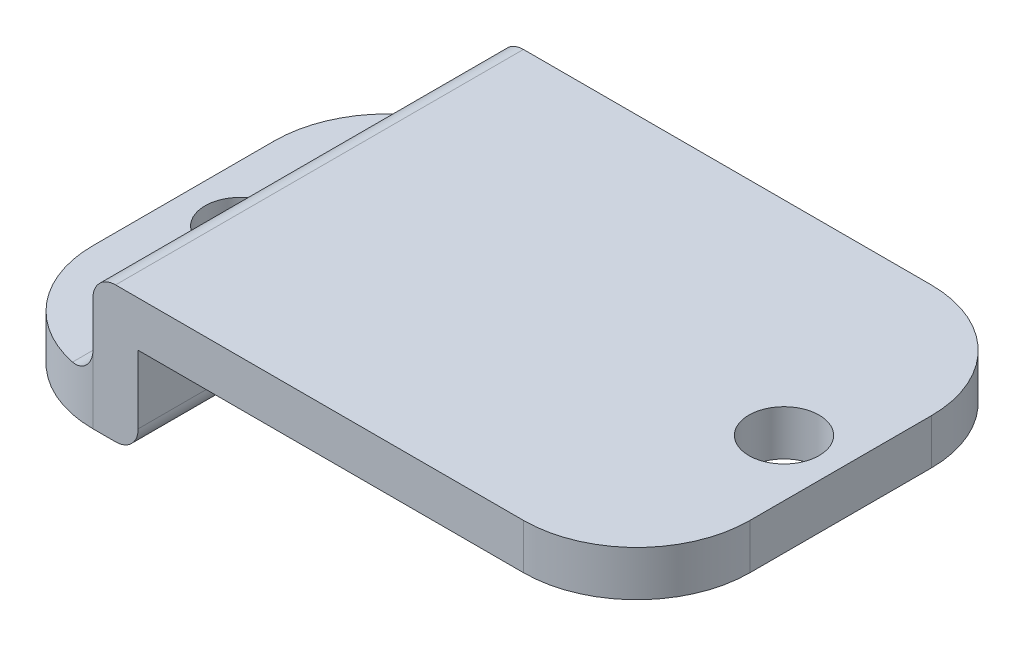
ISO-10303-21;
HEADER;
FILE_DESCRIPTION(('STEP AP214'),'2;1');
FILE_NAME('part.step','',(''),(''),'','','');
FILE_SCHEMA(('AUTOMOTIVE_DESIGN { 1 0 10303 214 1 1 1 1 }'));
ENDSEC;
DATA;
#1=APPLICATION_CONTEXT('core data for automotive mechanical design processes');
#2=APPLICATION_PROTOCOL_DEFINITION('international standard','automotive_design',2000,#1);
#3=PRODUCT_CONTEXT('',#1,'mechanical');
#4=PRODUCT('Part','Part','',(#3));
#5=PRODUCT_RELATED_PRODUCT_CATEGORY('part','',(#4));
#6=PRODUCT_DEFINITION_FORMATION('','',#4);
#7=PRODUCT_DEFINITION_CONTEXT('part definition',#1,'design');
#8=PRODUCT_DEFINITION('design','',#6,#7);
#9=PRODUCT_DEFINITION_SHAPE('','',#8);
#10=(LENGTH_UNIT() NAMED_UNIT(*) SI_UNIT(.MILLI.,.METRE.));
#11=(NAMED_UNIT(*) PLANE_ANGLE_UNIT() SI_UNIT($,.RADIAN.));
#12=(NAMED_UNIT(*) SI_UNIT($,.STERADIAN.) SOLID_ANGLE_UNIT());
#13=UNCERTAINTY_MEASURE_WITH_UNIT(LENGTH_MEASURE(1.E-05),#10,'distance_accuracy_value','');
#14=(GEOMETRIC_REPRESENTATION_CONTEXT(3) GLOBAL_UNCERTAINTY_ASSIGNED_CONTEXT((#13)) GLOBAL_UNIT_ASSIGNED_CONTEXT((#10,
#11,#12)) REPRESENTATION_CONTEXT('',''));
#15=CARTESIAN_POINT('',(0.,0.,0.));
#16=DIRECTION('',(0.,0.,1.));
#17=DIRECTION('',(1.,0.,0.));
#18=AXIS2_PLACEMENT_3D('',#15,#16,#17);
#19=CARTESIAN_POINT('',(0.,0.,18.));
#20=DIRECTION('',(0.,1.,0.));
#21=DIRECTION('',(0.,0.,1.));
#22=AXIS2_PLACEMENT_3D('',#19,#20,#21);
#23=PLANE('',#22);
#24=CARTESIAN_POINT('',(21.5,0.,9.));
#25=DIRECTION('',(0.,1.,0.));
#26=DIRECTION('',(0.,0.,1.));
#27=AXIS2_PLACEMENT_3D('',#24,#25,#26);
#28=CIRCLE('',#27,1.55);
#29=CARTESIAN_POINT('',(21.5,0.,10.55));
#30=VERTEX_POINT('',#29);
#31=EDGE_CURVE('E402',#30,#30,#28,.T.);
#32=ORIENTED_EDGE('',*,*,#31,.T.);
#33=EDGE_LOOP('',(#32));
#34=FACE_BOUND('',#33,.T.);
#35=DIRECTION('',(0.,0.,-1.));
#36=VECTOR('',#35,1.);
#37=CARTESIAN_POINT('',(24.,0.,18.));
#38=LINE('',#37,#36);
#39=CARTESIAN_POINT('',(24.,0.,13.));
#40=VERTEX_POINT('',#39);
#41=CARTESIAN_POINT('',(24.,0.,5.));
#42=VERTEX_POINT('',#41);
#43=EDGE_CURVE('E205',#40,#42,#38,.T.);
#44=ORIENTED_EDGE('',*,*,#43,.F.);
#45=CARTESIAN_POINT('',(19.,0.,13.));
#46=DIRECTION('',(0.,1.,0.));
#47=DIRECTION('',(0.,0.,1.));
#48=AXIS2_PLACEMENT_3D('',#45,#46,#47);
#49=CIRCLE('',#48,5.);
#50=CARTESIAN_POINT('',(19.,0.,18.));
#51=VERTEX_POINT('',#50);
#52=EDGE_CURVE('E172',#40,#51,#49,.F.);
#53=ORIENTED_EDGE('',*,*,#52,.T.);
#54=DIRECTION('',(1.,0.,0.));
#55=VECTOR('',#54,1.);
#56=CARTESIAN_POINT('',(0.,0.,18.));
#57=LINE('',#56,#55);
#58=CARTESIAN_POINT('',(2.,0.,18.));
#59=VERTEX_POINT('',#58);
#60=EDGE_CURVE('E169',#59,#51,#57,.T.);
#61=ORIENTED_EDGE('',*,*,#60,.F.);
#62=DIRECTION('',(0.,0.,-1.));
#63=VECTOR('',#62,1.);
#64=CARTESIAN_POINT('',(2.,0.,18.));
#65=LINE('',#64,#63);
#66=CARTESIAN_POINT('',(2.,0.,0.));
#67=VERTEX_POINT('',#66);
#68=EDGE_CURVE('E155',#59,#67,#65,.T.);
#69=ORIENTED_EDGE('',*,*,#68,.T.);
#70=DIRECTION('',(1.,0.,0.));
#71=VECTOR('',#70,1.);
#72=CARTESIAN_POINT('',(0.,0.,0.));
#73=LINE('',#72,#71);
#74=CARTESIAN_POINT('',(19.,0.,0.));
#75=VERTEX_POINT('',#74);
#76=EDGE_CURVE('E186',#67,#75,#73,.T.);
#77=ORIENTED_EDGE('',*,*,#76,.T.);
#78=CARTESIAN_POINT('',(19.,0.,5.));
#79=DIRECTION('',(0.,1.,0.));
#80=DIRECTION('',(0.,0.,1.));
#81=AXIS2_PLACEMENT_3D('',#78,#79,#80);
#82=CIRCLE('',#81,5.);
#83=EDGE_CURVE('E225',#75,#42,#82,.F.);
#84=ORIENTED_EDGE('',*,*,#83,.T.);
#85=EDGE_LOOP('',(#44,#53,#61,#69,#77,#84));
#86=FACE_BOUND('',#85,.T.);
#87=ADVANCED_FACE('F42',(#34,#86),#23,.F.);
#88=CARTESIAN_POINT('',(24.,0.,18.));
#89=DIRECTION('',(-1.,0.,0.));
#90=DIRECTION('',(0.,0.,1.));
#91=AXIS2_PLACEMENT_3D('',#88,#89,#90);
#92=PLANE('',#91);
#93=DIRECTION('',(0.,0.,-1.));
#94=VECTOR('',#93,1.);
#95=CARTESIAN_POINT('',(24.,2.,18.));
#96=LINE('',#95,#94);
#97=CARTESIAN_POINT('',(24.,2.,13.));
#98=VERTEX_POINT('',#97);
#99=CARTESIAN_POINT('',(24.,2.,5.));
#100=VERTEX_POINT('',#99);
#101=EDGE_CURVE('E202',#98,#100,#96,.T.);
#102=ORIENTED_EDGE('',*,*,#101,.F.);
#103=DIRECTION('',(0.,1.,0.));
#104=VECTOR('',#103,1.);
#105=CARTESIAN_POINT('',(24.,0.,13.));
#106=LINE('',#105,#104);
#107=EDGE_CURVE('E223',#98,#40,#106,.F.);
#108=ORIENTED_EDGE('',*,*,#107,.T.);
#109=ORIENTED_EDGE('',*,*,#43,.T.);
#110=DIRECTION('',(0.,1.,0.));
#111=VECTOR('',#110,1.);
#112=CARTESIAN_POINT('',(24.,0.,5.));
#113=LINE('',#112,#111);
#114=EDGE_CURVE('E220',#42,#100,#113,.T.);
#115=ORIENTED_EDGE('',*,*,#114,.T.);
#116=EDGE_LOOP('',(#102,#108,#109,#115));
#117=FACE_BOUND('',#116,.T.);
#118=ADVANCED_FACE('F340',(#117),#92,.F.);
#119=CARTESIAN_POINT('',(0.,2.,18.));
#120=DIRECTION('',(0.,1.,0.));
#121=DIRECTION('',(0.,0.,1.));
#122=AXIS2_PLACEMENT_3D('',#119,#120,#121);
#123=PLANE('',#122);
#124=CARTESIAN_POINT('',(21.5,2.,9.));
#125=DIRECTION('',(0.,1.,0.));
#126=DIRECTION('',(0.,0.,1.));
#127=AXIS2_PLACEMENT_3D('',#124,#125,#126);
#128=CIRCLE('',#127,1.55);
#129=CARTESIAN_POINT('',(21.5,2.,10.55));
#130=VERTEX_POINT('',#129);
#131=EDGE_CURVE('E416',#130,#130,#128,.T.);
#132=ORIENTED_EDGE('',*,*,#131,.F.);
#133=EDGE_LOOP('',(#132));
#134=FACE_BOUND('',#133,.T.);
#135=DIRECTION('',(1.,0.,0.));
#136=VECTOR('',#135,1.);
#137=CARTESIAN_POINT('',(0.,2.,0.));
#138=LINE('',#137,#136);
#139=CARTESIAN_POINT('',(1.,2.,0.));
#140=VERTEX_POINT('',#139);
#141=CARTESIAN_POINT('',(19.,2.,0.));
#142=VERTEX_POINT('',#141);
#143=EDGE_CURVE('E188',#140,#142,#138,.T.);
#144=ORIENTED_EDGE('',*,*,#143,.F.);
#145=DIRECTION('',(0.,0.,-1.));
#146=VECTOR('',#145,1.);
#147=CARTESIAN_POINT('',(1.,2.,18.));
#148=LINE('',#147,#146);
#149=CARTESIAN_POINT('',(1.,2.,18.));
#150=VERTEX_POINT('',#149);
#151=EDGE_CURVE('E372',#140,#150,#148,.F.);
#152=ORIENTED_EDGE('',*,*,#151,.T.);
#153=DIRECTION('',(1.,0.,0.));
#154=VECTOR('',#153,1.);
#155=CARTESIAN_POINT('',(0.,2.,18.));
#156=LINE('',#155,#154);
#157=CARTESIAN_POINT('',(19.,2.,18.));
#158=VERTEX_POINT('',#157);
#159=EDGE_CURVE('E176',#150,#158,#156,.T.);
#160=ORIENTED_EDGE('',*,*,#159,.T.);
#161=CARTESIAN_POINT('',(19.,2.,13.));
#162=DIRECTION('',(0.,1.,0.));
#163=DIRECTION('',(0.,0.,1.));
#164=AXIS2_PLACEMENT_3D('',#161,#162,#163);
#165=CIRCLE('',#164,5.);
#166=EDGE_CURVE('E218',#158,#98,#165,.T.);
#167=ORIENTED_EDGE('',*,*,#166,.T.);
#168=ORIENTED_EDGE('',*,*,#101,.T.);
#169=CARTESIAN_POINT('',(19.,2.,5.));
#170=DIRECTION('',(0.,1.,0.));
#171=DIRECTION('',(0.,0.,1.));
#172=AXIS2_PLACEMENT_3D('',#169,#170,#171);
#173=CIRCLE('',#172,5.);
#174=EDGE_CURVE('E215',#100,#142,#173,.T.);
#175=ORIENTED_EDGE('',*,*,#174,.T.);
#176=EDGE_LOOP('',(#144,#152,#160,#167,#168,#175));
#177=FACE_BOUND('',#176,.T.);
#178=ADVANCED_FACE('F274',(#134,#177),#123,.T.);
#179=CARTESIAN_POINT('',(0.,0.,18.));
#180=DIRECTION('',(-1.,0.,0.));
#181=DIRECTION('',(0.,0.,1.));
#182=AXIS2_PLACEMENT_3D('',#179,#180,#181);
#183=PLANE('',#182);
#184=DIRECTION('',(0.,1.,0.));
#185=VECTOR('',#184,1.);
#186=CARTESIAN_POINT('',(0.,0.,18.));
#187=LINE('',#186,#185);
#188=CARTESIAN_POINT('',(0.,-1.,18.));
#189=VERTEX_POINT('',#188);
#190=CARTESIAN_POINT('',(0.,1.,18.));
#191=VERTEX_POINT('',#190);
#192=EDGE_CURVE('E182',#189,#191,#187,.T.);
#193=ORIENTED_EDGE('',*,*,#192,.T.);
#194=DIRECTION('',(0.,0.,-1.));
#195=VECTOR('',#194,1.);
#196=CARTESIAN_POINT('',(0.,1.,18.));
#197=LINE('',#196,#195);
#198=CARTESIAN_POINT('',(0.,1.,0.));
#199=VERTEX_POINT('',#198);
#200=EDGE_CURVE('E302',#191,#199,#197,.T.);
#201=ORIENTED_EDGE('',*,*,#200,.T.);
#202=DIRECTION('',(0.,1.,0.));
#203=VECTOR('',#202,1.);
#204=CARTESIAN_POINT('',(0.,0.,0.));
#205=LINE('',#204,#203);
#206=CARTESIAN_POINT('',(0.,-1.,0.));
#207=VERTEX_POINT('',#206);
#208=EDGE_CURVE('E191',#207,#199,#205,.T.);
#209=ORIENTED_EDGE('',*,*,#208,.F.);
#210=DIRECTION('',(0.,0.,-1.));
#211=VECTOR('',#210,1.);
#212=CARTESIAN_POINT('',(0.,-1.,18.));
#213=LINE('',#212,#211);
#214=CARTESIAN_POINT('',(0.,-1.,8.60948751620466));
#215=VERTEX_POINT('',#214);
#216=EDGE_CURVE('E262',#207,#215,#213,.F.);
#217=ORIENTED_EDGE('',*,*,#216,.T.);
#218=CARTESIAN_POINT('',(0.,-1.09003543689552,7.73114573292491));
#219=CARTESIAN_POINT('',(0.,-2.42157033807594,8.12303743279418));
#220=CARTESIAN_POINT('',(-1.31660479774297,-2.,7.99896264041992));
#221=CARTESIAN_POINT('',(0.,-1.07928016102303,7.76768773547615));
#222=CARTESIAN_POINT('',(0.,-2.39908223397735,8.12252411531241));
#223=CARTESIAN_POINT('',(-1.30239846010283,-2.,8.01576355059714));
#224=CARTESIAN_POINT('',(0.,-1.06980181869871,7.80457949808054));
#225=CARTESIAN_POINT('',(0.,-2.37597461450016,8.12553747485484));
#226=CARTESIAN_POINT('',(-1.28788341301531,-2.,8.03364170415246));
#227=CARTESIAN_POINT('',(0.,-1.05311393642863,7.87882876282085));
#228=CARTESIAN_POINT('',(0.,-2.33005241252144,8.13825303283099));
#229=CARTESIAN_POINT('',(-1.25850400990097,-2.,8.07168541794181));
#230=CARTESIAN_POINT('',(0.,-1.04590164320957,7.91618564198294));
#231=CARTESIAN_POINT('',(0.,-2.30723047041813,8.14781522600585));
#232=CARTESIAN_POINT('',(-1.24364010153966,-2.,8.0918481615091));
#233=CARTESIAN_POINT('',(0.,-1.02728421249813,8.02825153154218));
#234=CARTESIAN_POINT('',(0.,-2.24143140090433,8.18513901062904));
#235=CARTESIAN_POINT('',(-1.19906677475243,-2.,8.15574908695555));
#236=CARTESIAN_POINT('',(0.,-1.01876671693618,8.1034352298377));
#237=CARTESIAN_POINT('',(0.,-2.19936494201809,8.22161890935074));
#238=CARTESIAN_POINT('',(-1.16918477752232,-2.,8.20311432810635));
#239=CARTESIAN_POINT('',(0.,-1.00704595596801,8.25389318594509));
#240=CARTESIAN_POINT('',(0.,-2.12450783455355,8.31314430348107));
#241=CARTESIAN_POINT('',(-1.1117459333888,-2.,8.30803971441191));
#242=CARTESIAN_POINT('',(0.,-1.00382562685524,8.32916636822336));
#243=CARTESIAN_POINT('',(0.,-2.09124146326484,8.36771321795233));
#244=CARTESIAN_POINT('',(-1.08418189303075,-2.,8.36556646061761));
#245=CARTESIAN_POINT('',(0.,-1.00025821169638,8.47989462850047));
#246=CARTESIAN_POINT('',(0.,-2.03546129037314,8.48984515653921));
#247=CARTESIAN_POINT('',(-1.03454933046074,-2.,8.49062842180128));
#248=CARTESIAN_POINT('',(0.,-0.999916346581259,8.55534978881912));
#249=CARTESIAN_POINT('',(0.,-2.01249678050055,8.55751719129305));
#250=CARTESIAN_POINT('',(-1.01249086446779,-2.,8.55818159697194));
#251=CARTESIAN_POINT('',(0.,-1.00007371476951,8.6773295298595));
#252=CARTESIAN_POINT('',(0.,-1.98427393708783,8.67335715514308));
#253=CARTESIAN_POINT('',(-0.984083818187835,-2.,8.67356166491347));
#254=CARTESIAN_POINT('',(0.,-1.00030077567148,8.7238571226712));
#255=CARTESIAN_POINT('',(0.,-1.9755489936108,8.71898148410816));
#256=CARTESIAN_POINT('',(-0.974954456115593,-2.,8.71902448191335));
#257=CARTESIAN_POINT('',(0.,-1.00075753191996,8.81691183846399));
#258=CARTESIAN_POINT('',(0.,-1.96222742646399,8.81193038487518));
#259=CARTESIAN_POINT('',(-0.960739932607024,-2.,8.81190076829794));
#260=CARTESIAN_POINT('',(0.,-1.00098722720377,8.86343896142998));
#261=CARTESIAN_POINT('',(0.,-1.95757606354754,8.85942734701155));
#262=CARTESIAN_POINT('',(-0.955654675092457,-2.,8.85931419131277));
#263=CARTESIAN_POINT('',(0.,-1.00125124891286,8.9564565802129));
#264=CARTESIAN_POINT('',(0.,-1.95236079562052,8.95492396736893));
#265=CARTESIAN_POINT('',(-0.949916747067699,-2.,8.95491234886565));
#266=CARTESIAN_POINT('',(0.,-1.0012857313538,9.00294707557984));
#267=CARTESIAN_POINT('',(0.,-1.95177146450425,9.00312318022655));
#268=CARTESIAN_POINT('',(-0.949260536747216,-2.,9.00309643658521));
#269=CARTESIAN_POINT('',(0.,-1.00113494817345,9.09592914931454));
#270=CARTESIAN_POINT('',(0.,-1.95463319292473,9.09891379895112));
#271=CARTESIAN_POINT('',(-0.952421824644977,-2.,9.09902021393609));
#272=CARTESIAN_POINT('',(0.,-1.00094967529898,9.14242072766741));
#273=CARTESIAN_POINT('',(0.,-1.95809660185332,9.14670886801174));
#274=CARTESIAN_POINT('',(-0.956239470525928,-2.,9.14675988884684));
#275=CARTESIAN_POINT('',(0.,-1.00050575805981,9.23552633215981));
#276=CARTESIAN_POINT('',(0.,-1.96905950292135,9.240693757596));
#277=CARTESIAN_POINT('',(-0.968072412476987,-2.,9.2407225358382));
#278=CARTESIAN_POINT('',(0.,-1.00024692116838,9.28214035733437));
#279=CARTESIAN_POINT('',(0.,-1.97661536063471,9.28706202308078));
#280=CARTESIAN_POINT('',(-0.976098770503647,-2.,9.28694116823137));
#281=CARTESIAN_POINT('',(0.,-0.999960345997754,9.37536524054435));
#282=CARTESIAN_POINT('',(0.,-1.99574510861641,9.3769583589127));
#283=CARTESIAN_POINT('',(-0.995775993751439,-2.,9.37672859624485));
#284=CARTESIAN_POINT('',(0.,-0.99993258804094,9.42197609851144));
#285=CARTESIAN_POINT('',(0.,-2.00739396028633,9.42062756422832));
#286=CARTESIAN_POINT('',(-1.00742655026489,-2.,9.42029761718019));
#287=CARTESIAN_POINT('',(0.,-1.00052945831433,9.51524057756412));
#288=CARTESIAN_POINT('',(0.,-2.03467061674831,9.50405933041651));
#289=CARTESIAN_POINT('',(-1.03360596920178,-2.,9.50410026805277));
#290=CARTESIAN_POINT('',(0.,-1.00115468748894,9.56189419849248));
#291=CARTESIAN_POINT('',(0.,-2.0504000742091,9.54389963788757));
#292=CARTESIAN_POINT('',(-1.04813747298292,-2.,9.54433078875475));
#293=CARTESIAN_POINT('',(0.,-1.00357615075752,9.65518504907134));
#294=CARTESIAN_POINT('',(0.,-2.0856338616496,9.61860045491195));
#295=CARTESIAN_POINT('',(-1.07925861405162,-2.,9.62106475279473));
#296=CARTESIAN_POINT('',(0.,-1.00537279056877,9.70182226743931));
#297=CARTESIAN_POINT('',(0.,-2.10524987075338,9.65347354744946));
#298=CARTESIAN_POINT('',(-1.09584896280623,-2.,9.65756689974471));
#299=CARTESIAN_POINT('',(0.,-1.00801403384658,9.7484269904827));
#300=CARTESIAN_POINT('',(0.,-2.12644609345599,9.68482687535042));
#301=CARTESIAN_POINT('',(-1.11305657091066,-2.,9.6920172862768));
#302=(BOUNDED_SURFACE() B_SPLINE_SURFACE(3,2,((#218,#219,#220),(#221,#222,#223),(#224,#225,
#226),(#227,#228,#229),(#230,#231,#232),(#233,#234,#235),(#236,#237,#238),(#239,#240,#241),
(#242,#243,#244),(#245,#246,#247),(#248,#249,#250),(#251,#252,#253),(#254,#255,#256),(#257,#258,
#259),(#260,#261,#262),(#263,#264,#265),(#266,#267,#268),(#269,#270,#271),(#272,#273,#274),
(#275,#276,#277),(#278,#279,#280),(#281,#282,#283),(#284,#285,#286),(#287,#288,#289),(#290,#291,
#292),(#293,#294,#295),(#296,#297,#298),(#299,#300,#301)),.UNSPECIFIED.,.F.,.F.,
.F.) B_SPLINE_SURFACE_WITH_KNOTS((4,2,2,2,2,2,2,2,2,2,2,2,2,4),(3,3),(0.,0.114215310613203,
0.228291306929113,0.454960161183239,0.680897409239857,0.90724437207455,1.04683026861018,
1.1864128488201,1.32588385775956,1.46535947016544,1.60520352413813,1.74503566951408,
1.8849966159806,2.02500606359473),(0.,1.),
.UNSPECIFIED.) GEOMETRIC_REPRESENTATION_ITEM() RATIONAL_B_SPLINE_SURFACE(((1.,0.584549057931422,
1.),(1.,0.590626395726221,1.),(1.,0.596737597822393,1.),(1.,0.608920968233159,1.),(1.,
0.61499317506706,1.),(1.,0.632935967591139,1.),(1.,0.644614205713254,1.),(1.,0.666518620231557,
1.),(1.,0.676749361704814,1.),(1.,0.694844157032491,1.),(1.,0.702703885490777,1.),(1.,
0.712722125647196,1.),(1.,0.715911167890255,1.),(1.,0.720857989376532,1.),(1.,0.722615802622349,
1.),(1.,0.724598271992875,1.),(1.,0.724824152478987,1.),(1.,0.723732936008131,1.),(1.,
0.722415788122447,1.),(1.,0.718309069889206,1.),(1.,0.715515619152292,1.),(1.,0.708607000482008,
1.),(1.,0.704491945121388,1.),(1.,0.695139249167702,1.),(1.,0.689900578039128,1.),(1.,
0.678530608941541,1.),(1.,0.672399002276571,1.),(1.,0.665936719624822,1.))) REPRESENTATION_ITEM('') SURFACE());
#303=CARTESIAN_POINT('',(0.,-1.09003543689552,7.73114573292491));
#304=CARTESIAN_POINT('',(0.,-1.07928016102303,7.76768773547615));
#305=CARTESIAN_POINT('',(0.,-1.06980181869871,7.80457949808054));
#306=CARTESIAN_POINT('',(0.,-1.05311393642863,7.87882876282085));
#307=CARTESIAN_POINT('',(0.,-1.04590164320957,7.91618564198294));
#308=CARTESIAN_POINT('',(0.,-1.02728421249813,8.02825153154218));
#309=CARTESIAN_POINT('',(0.,-1.01876671693618,8.1034352298377));
#310=CARTESIAN_POINT('',(0.,-1.00704595596801,8.25389318594509));
#311=CARTESIAN_POINT('',(0.,-1.00382562685524,8.32916636822336));
#312=CARTESIAN_POINT('',(0.,-1.00025821169638,8.47989462850047));
#313=CARTESIAN_POINT('',(0.,-0.999916346581259,8.55534978881912));
#314=CARTESIAN_POINT('',(0.,-1.00007371476951,8.6773295298595));
#315=CARTESIAN_POINT('',(0.,-1.00030077567148,8.7238571226712));
#316=CARTESIAN_POINT('',(0.,-1.00075753191996,8.81691183846399));
#317=CARTESIAN_POINT('',(0.,-1.00098722720377,8.86343896142998));
#318=CARTESIAN_POINT('',(0.,-1.00125124891286,8.9564565802129));
#319=CARTESIAN_POINT('',(0.,-1.0012857313538,9.00294707557984));
#320=CARTESIAN_POINT('',(0.,-1.00113494817345,9.09592914931455));
#321=CARTESIAN_POINT('',(0.,-1.00094967529898,9.14242072766741));
#322=CARTESIAN_POINT('',(0.,-1.00050575805981,9.23552633215981));
#323=CARTESIAN_POINT('',(0.,-1.00024692116838,9.28214035733437));
#324=CARTESIAN_POINT('',(0.,-0.999960345997754,9.37536524054435));
#325=CARTESIAN_POINT('',(0.,-0.99993258804094,9.42197609851144));
#326=CARTESIAN_POINT('',(0.,-1.00052945831433,9.51524057756412));
#327=CARTESIAN_POINT('',(0.,-1.00115468748894,9.56189419849248));
#328=CARTESIAN_POINT('',(0.,-1.00357615075752,9.65518504907134));
#329=CARTESIAN_POINT('',(0.,-1.00537279056877,9.70182226743931));
#330=CARTESIAN_POINT('',(0.,-1.00801403384658,9.7484269904827));
#331=B_SPLINE_CURVE_WITH_KNOTS('',3,(#303,#304,#305,#306,#307,#308,#309,#310,#311,#312,#313,
#314,#315,#316,#317,#318,#319,#320,#321,#322,#323,#324,#325,#326,#327,#328,#329,#330),
.UNSPECIFIED.,.F.,.F.,(4,2,2,2,2,2,2,2,2,2,2,2,2,4),(0.,0.114215310613203,0.228291306929113,
0.454960161183239,0.680897409239857,0.90724437207455,1.04683026861018,1.1864128488201,
1.32588385775956,1.46535947016544,1.60520352413813,1.74503566951408,1.8849966159806,
2.02500606359473),.UNSPECIFIED.);
#332=CARTESIAN_POINT('',(0.,-1.,9.39051248379533));
#333=VERTEX_POINT('',#332);
#334=EDGE_CURVE('E254',#215,#333,#331,.T.);
#335=ORIENTED_EDGE('',*,*,#334,.T.);
#336=DIRECTION('',(0.,0.,-1.));
#337=VECTOR('',#336,1.);
#338=CARTESIAN_POINT('',(0.,-1.,18.));
#339=LINE('',#338,#337);
#340=EDGE_CURVE('E251',#333,#189,#339,.F.);
#341=ORIENTED_EDGE('',*,*,#340,.T.);
#342=EDGE_LOOP('',(#193,#201,#209,#217,#335,#341));
#343=FACE_BOUND('',#342,.T.);
#344=ADVANCED_FACE('F268',(#343),#183,.T.);
#345=CARTESIAN_POINT('',(0.,-2.,18.));
#346=DIRECTION('',(0.,-1.,0.));
#347=DIRECTION('',(0.,0.,-1.));
#348=AXIS2_PLACEMENT_3D('',#345,#346,#347);
#349=PLANE('',#348);
#350=CARTESIAN_POINT('',(0.,-2.,13.));
#351=DIRECTION('',(0.,-1.,0.));
#352=DIRECTION('',(0.,0.,-1.));
#353=AXIS2_PLACEMENT_3D('',#350,#351,#352);
#354=CIRCLE('',#353,5.);
#355=CARTESIAN_POINT('',(-5.,-2.,13.));
#356=VERTEX_POINT('',#355);
#357=CARTESIAN_POINT('',(-1.,-2.,17.8989794855664));
#358=VERTEX_POINT('',#357);
#359=EDGE_CURVE('E232',#356,#358,#354,.F.);
#360=ORIENTED_EDGE('',*,*,#359,.T.);
#361=DIRECTION('',(0.,0.,-1.));
#362=VECTOR('',#361,1.);
#363=CARTESIAN_POINT('',(-1.,-2.,18.));
#364=LINE('',#363,#362);
#365=CARTESIAN_POINT('',(-1.,-2.,9.39051248379533));
#366=VERTEX_POINT('',#365);
#367=EDGE_CURVE('E248',#358,#366,#364,.T.);
#368=ORIENTED_EDGE('',*,*,#367,.T.);
#369=CARTESIAN_POINT('',(-2.5,-2.,9.));
#370=DIRECTION('',(0.,1.,0.));
#371=DIRECTION('',(0.,0.,1.));
#372=AXIS2_PLACEMENT_3D('',#369,#370,#371);
#373=CIRCLE('',#372,1.55);
#374=CARTESIAN_POINT('',(-1.,-2.,8.60948751620466));
#375=VERTEX_POINT('',#374);
#376=EDGE_CURVE('E400',#375,#366,#373,.T.);
#377=ORIENTED_EDGE('',*,*,#376,.F.);
#378=DIRECTION('',(0.,0.,-1.));
#379=VECTOR('',#378,1.);
#380=CARTESIAN_POINT('',(-1.,-2.,18.));
#381=LINE('',#380,#379);
#382=CARTESIAN_POINT('',(-1.,-2.,0.101020514433644));
#383=VERTEX_POINT('',#382);
#384=EDGE_CURVE('E246',#375,#383,#381,.T.);
#385=ORIENTED_EDGE('',*,*,#384,.T.);
#386=CARTESIAN_POINT('',(0.,-2.,5.));
#387=DIRECTION('',(0.,-1.,0.));
#388=DIRECTION('',(0.,0.,-1.));
#389=AXIS2_PLACEMENT_3D('',#386,#387,#388);
#390=CIRCLE('',#389,5.);
#391=CARTESIAN_POINT('',(-5.,-2.,5.));
#392=VERTEX_POINT('',#391);
#393=EDGE_CURVE('E235',#383,#392,#390,.F.);
#394=ORIENTED_EDGE('',*,*,#393,.T.);
#395=DIRECTION('',(0.,0.,-1.));
#396=VECTOR('',#395,1.);
#397=CARTESIAN_POINT('',(-5.,-2.,18.));
#398=LINE('',#397,#396);
#399=EDGE_CURVE('E199',#356,#392,#398,.T.);
#400=ORIENTED_EDGE('',*,*,#399,.F.);
#401=EDGE_LOOP('',(#360,#368,#377,#385,#394,#400));
#402=FACE_BOUND('',#401,.T.);
#403=ADVANCED_FACE('F273',(#402),#349,.F.);
#404=CARTESIAN_POINT('',(-5.,0.,18.));
#405=DIRECTION('',(-1.,0.,0.));
#406=DIRECTION('',(0.,0.,1.));
#407=AXIS2_PLACEMENT_3D('',#404,#405,#406);
#408=PLANE('',#407);
#409=ORIENTED_EDGE('',*,*,#399,.T.);
#410=DIRECTION('',(0.,1.,0.));
#411=VECTOR('',#410,1.);
#412=CARTESIAN_POINT('',(-5.,-4.,5.));
#413=LINE('',#412,#411);
#414=CARTESIAN_POINT('',(-5.,-4.,5.));
#415=VERTEX_POINT('',#414);
#416=EDGE_CURVE('E240',#392,#415,#413,.F.);
#417=ORIENTED_EDGE('',*,*,#416,.T.);
#418=DIRECTION('',(0.,0.,-1.));
#419=VECTOR('',#418,1.);
#420=CARTESIAN_POINT('',(-5.,-4.,18.));
#421=LINE('',#420,#419);
#422=CARTESIAN_POINT('',(-5.,-4.,13.));
#423=VERTEX_POINT('',#422);
#424=EDGE_CURVE('E166',#423,#415,#421,.T.);
#425=ORIENTED_EDGE('',*,*,#424,.F.);
#426=DIRECTION('',(0.,1.,0.));
#427=VECTOR('',#426,1.);
#428=CARTESIAN_POINT('',(-5.,0.,13.));
#429=LINE('',#428,#427);
#430=EDGE_CURVE('E237',#423,#356,#429,.T.);
#431=ORIENTED_EDGE('',*,*,#430,.T.);
#432=EDGE_LOOP('',(#409,#417,#425,#431));
#433=FACE_BOUND('',#432,.T.);
#434=ADVANCED_FACE('F408',(#433),#408,.T.);
#435=CARTESIAN_POINT('',(0.,-4.,18.));
#436=DIRECTION('',(0.,1.,0.));
#437=DIRECTION('',(0.,0.,1.));
#438=AXIS2_PLACEMENT_3D('',#435,#436,#437);
#439=PLANE('',#438);
#440=CARTESIAN_POINT('',(-2.5,-4.,9.));
#441=DIRECTION('',(0.,1.,0.));
#442=DIRECTION('',(0.,0.,1.));
#443=AXIS2_PLACEMENT_3D('',#440,#441,#442);
#444=CIRCLE('',#443,1.55);
#445=CARTESIAN_POINT('',(-2.5,-4.,10.55));
#446=VERTEX_POINT('',#445);
#447=EDGE_CURVE('E189',#446,#446,#444,.T.);
#448=ORIENTED_EDGE('',*,*,#447,.T.);
#449=EDGE_LOOP('',(#448));
#450=FACE_BOUND('',#449,.T.);
#451=DIRECTION('',(1.,0.,0.));
#452=VECTOR('',#451,1.);
#453=CARTESIAN_POINT('',(0.,-4.,0.));
#454=LINE('',#453,#452);
#455=CARTESIAN_POINT('',(0.,-4.,0.));
#456=VERTEX_POINT('',#455);
#457=CARTESIAN_POINT('',(1.,-4.,0.));
#458=VERTEX_POINT('',#457);
#459=EDGE_CURVE('E194',#456,#458,#454,.T.);
#460=ORIENTED_EDGE('',*,*,#459,.T.);
#461=DIRECTION('',(0.,0.,-1.));
#462=VECTOR('',#461,1.);
#463=CARTESIAN_POINT('',(1.,-4.,18.));
#464=LINE('',#463,#462);
#465=CARTESIAN_POINT('',(1.,-4.,18.));
#466=VERTEX_POINT('',#465);
#467=EDGE_CURVE('E50',#458,#466,#464,.F.);
#468=ORIENTED_EDGE('',*,*,#467,.T.);
#469=DIRECTION('',(1.,0.,0.));
#470=VECTOR('',#469,1.);
#471=CARTESIAN_POINT('',(0.,-4.,18.));
#472=LINE('',#471,#470);
#473=CARTESIAN_POINT('',(0.,-4.,18.));
#474=VERTEX_POINT('',#473);
#475=EDGE_CURVE('E180',#474,#466,#472,.T.);
#476=ORIENTED_EDGE('',*,*,#475,.F.);
#477=CARTESIAN_POINT('',(0.,-4.,13.));
#478=DIRECTION('',(0.,1.,0.));
#479=DIRECTION('',(0.,0.,1.));
#480=AXIS2_PLACEMENT_3D('',#477,#478,#479);
#481=CIRCLE('',#480,5.);
#482=EDGE_CURVE('E242',#474,#423,#481,.F.);
#483=ORIENTED_EDGE('',*,*,#482,.T.);
#484=ORIENTED_EDGE('',*,*,#424,.T.);
#485=CARTESIAN_POINT('',(0.,-4.,5.));
#486=DIRECTION('',(0.,1.,0.));
#487=DIRECTION('',(0.,0.,1.));
#488=AXIS2_PLACEMENT_3D('',#485,#486,#487);
#489=CIRCLE('',#488,5.);
#490=EDGE_CURVE('E244',#415,#456,#489,.F.);
#491=ORIENTED_EDGE('',*,*,#490,.T.);
#492=EDGE_LOOP('',(#460,#468,#476,#483,#484,#491));
#493=FACE_BOUND('',#492,.T.);
#494=ADVANCED_FACE('F405',(#450,#493),#439,.F.);
#495=CARTESIAN_POINT('',(2.,0.,18.));
#496=DIRECTION('',(1.,0.,0.));
#497=DIRECTION('',(0.,1.,0.));
#498=AXIS2_PLACEMENT_3D('',#495,#496,#497);
#499=PLANE('',#498);
#500=DIRECTION('',(0.,-1.,0.));
#501=VECTOR('',#500,1.);
#502=CARTESIAN_POINT('',(2.,0.,18.));
#503=LINE('',#502,#501);
#504=CARTESIAN_POINT('',(2.,-3.,18.));
#505=VERTEX_POINT('',#504);
#506=EDGE_CURVE('E160',#59,#505,#503,.T.);
#507=ORIENTED_EDGE('',*,*,#506,.T.);
#508=DIRECTION('',(0.,0.,-1.));
#509=VECTOR('',#508,1.);
#510=CARTESIAN_POINT('',(2.,-3.,0.));
#511=LINE('',#510,#509);
#512=CARTESIAN_POINT('',(2.,-3.,0.));
#513=VERTEX_POINT('',#512);
#514=EDGE_CURVE('E374',#505,#513,#511,.T.);
#515=ORIENTED_EDGE('',*,*,#514,.T.);
#516=DIRECTION('',(0.,-1.,0.));
#517=VECTOR('',#516,1.);
#518=CARTESIAN_POINT('',(2.,0.,0.));
#519=LINE('',#518,#517);
#520=EDGE_CURVE('E162',#67,#513,#519,.T.);
#521=ORIENTED_EDGE('',*,*,#520,.F.);
#522=ORIENTED_EDGE('',*,*,#68,.F.);
#523=EDGE_LOOP('',(#507,#515,#521,#522));
#524=FACE_BOUND('',#523,.T.);
#525=ADVANCED_FACE('F157',(#524),#499,.T.);
#526=CARTESIAN_POINT('',(0.,0.,18.));
#527=DIRECTION('',(0.,0.,1.));
#528=DIRECTION('',(1.,0.,0.));
#529=AXIS2_PLACEMENT_3D('',#526,#527,#528);
#530=PLANE('',#529);
#531=ORIENTED_EDGE('',*,*,#475,.T.);
#532=CARTESIAN_POINT('',(1.,-3.,18.));
#533=DIRECTION('',(0.,0.,1.));
#534=DIRECTION('',(1.,0.,0.));
#535=AXIS2_PLACEMENT_3D('',#532,#533,#534);
#536=CIRCLE('',#535,1.);
#537=EDGE_CURVE('E11',#466,#505,#536,.T.);
#538=ORIENTED_EDGE('',*,*,#537,.T.);
#539=ORIENTED_EDGE('',*,*,#506,.F.);
#540=ORIENTED_EDGE('',*,*,#60,.T.);
#541=DIRECTION('',(0.,1.,0.));
#542=VECTOR('',#541,1.);
#543=CARTESIAN_POINT('',(19.,2.,18.));
#544=LINE('',#543,#542);
#545=EDGE_CURVE('E213',#51,#158,#544,.T.);
#546=ORIENTED_EDGE('',*,*,#545,.T.);
#547=ORIENTED_EDGE('',*,*,#159,.F.);
#548=CARTESIAN_POINT('',(1.,1.,18.));
#549=DIRECTION('',(0.,0.,1.));
#550=DIRECTION('',(1.,0.,0.));
#551=AXIS2_PLACEMENT_3D('',#548,#549,#550);
#552=CIRCLE('',#551,1.);
#553=EDGE_CURVE('E365',#150,#191,#552,.T.);
#554=ORIENTED_EDGE('',*,*,#553,.T.);
#555=ORIENTED_EDGE('',*,*,#192,.F.);
#556=DIRECTION('',(0.,1.,0.));
#557=VECTOR('',#556,1.);
#558=CARTESIAN_POINT('',(0.,0.,18.));
#559=LINE('',#558,#557);
#560=EDGE_CURVE('E208',#189,#474,#559,.F.);
#561=ORIENTED_EDGE('',*,*,#560,.T.);
#562=EDGE_LOOP('',(#531,#538,#539,#540,#546,#547,#554,#555,#561));
#563=FACE_BOUND('',#562,.T.);
#564=ADVANCED_FACE('F178',(#563),#530,.T.);
#565=CARTESIAN_POINT('',(0.,0.,0.));
#566=DIRECTION('',(0.,0.,1.));
#567=DIRECTION('',(1.,0.,0.));
#568=AXIS2_PLACEMENT_3D('',#565,#566,#567);
#569=PLANE('',#568);
#570=ORIENTED_EDGE('',*,*,#520,.T.);
#571=CARTESIAN_POINT('',(1.,-3.,0.));
#572=DIRECTION('',(0.,0.,1.));
#573=DIRECTION('',(1.,0.,0.));
#574=AXIS2_PLACEMENT_3D('',#571,#572,#573);
#575=CIRCLE('',#574,1.);
#576=EDGE_CURVE('E64',#513,#458,#575,.F.);
#577=ORIENTED_EDGE('',*,*,#576,.T.);
#578=ORIENTED_EDGE('',*,*,#459,.F.);
#579=DIRECTION('',(0.,1.,0.));
#580=VECTOR('',#579,1.);
#581=CARTESIAN_POINT('',(0.,-2.,0.));
#582=LINE('',#581,#580);
#583=EDGE_CURVE('E228',#456,#207,#582,.T.);
#584=ORIENTED_EDGE('',*,*,#583,.T.);
#585=ORIENTED_EDGE('',*,*,#208,.T.);
#586=CARTESIAN_POINT('',(1.,1.,0.));
#587=DIRECTION('',(0.,0.,1.));
#588=DIRECTION('',(1.,0.,0.));
#589=AXIS2_PLACEMENT_3D('',#586,#587,#588);
#590=CIRCLE('',#589,1.);
#591=EDGE_CURVE('E377',#199,#140,#590,.F.);
#592=ORIENTED_EDGE('',*,*,#591,.T.);
#593=ORIENTED_EDGE('',*,*,#143,.T.);
#594=DIRECTION('',(0.,1.,0.));
#595=VECTOR('',#594,1.);
#596=CARTESIAN_POINT('',(19.,0.,0.));
#597=LINE('',#596,#595);
#598=EDGE_CURVE('E230',#142,#75,#597,.F.);
#599=ORIENTED_EDGE('',*,*,#598,.T.);
#600=ORIENTED_EDGE('',*,*,#76,.F.);
#601=EDGE_LOOP('',(#570,#577,#578,#584,#585,#592,#593,#599,#600));
#602=FACE_BOUND('',#601,.T.);
#603=ADVANCED_FACE('F415',(#602),#569,.F.);
#604=CARTESIAN_POINT('',(-2.5,-20.,9.));
#605=DIRECTION('',(0.,1.,0.));
#606=DIRECTION('',(0.,0.,1.));
#607=AXIS2_PLACEMENT_3D('',#604,#605,#606);
#608=CYLINDRICAL_SURFACE('',#607,1.55);
#609=EDGE_CURVE('E211',#366,#375,#373,.T.);
#610=ORIENTED_EDGE('',*,*,#609,.T.);
#611=ORIENTED_EDGE('',*,*,#376,.T.);
#612=EDGE_LOOP('',(#610,#611));
#613=FACE_BOUND('',#612,.T.);
#614=ORIENTED_EDGE('',*,*,#447,.F.);
#615=EDGE_LOOP('',(#614));
#616=FACE_BOUND('',#615,.T.);
#617=ADVANCED_FACE('F357',(#613,#616),#608,.F.);
#618=CARTESIAN_POINT('',(21.5,-16.,9.));
#619=DIRECTION('',(0.,1.,0.));
#620=DIRECTION('',(0.,0.,1.));
#621=AXIS2_PLACEMENT_3D('',#618,#619,#620);
#622=CYLINDRICAL_SURFACE('',#621,1.55);
#623=ORIENTED_EDGE('',*,*,#131,.T.);
#624=EDGE_LOOP('',(#623));
#625=FACE_BOUND('',#624,.T.);
#626=ORIENTED_EDGE('',*,*,#31,.F.);
#627=EDGE_LOOP('',(#626));
#628=FACE_BOUND('',#627,.T.);
#629=ADVANCED_FACE('F350',(#625,#628),#622,.F.);
#630=CARTESIAN_POINT('',(19.,0.,13.));
#631=DIRECTION('',(0.,-1.,0.));
#632=DIRECTION('',(0.,0.,-1.));
#633=AXIS2_PLACEMENT_3D('',#630,#631,#632);
#634=CYLINDRICAL_SURFACE('',#633,5.);
#635=ORIENTED_EDGE('',*,*,#52,.F.);
#636=ORIENTED_EDGE('',*,*,#107,.F.);
#637=ORIENTED_EDGE('',*,*,#166,.F.);
#638=ORIENTED_EDGE('',*,*,#545,.F.);
#639=EDGE_LOOP('',(#635,#636,#637,#638));
#640=FACE_BOUND('',#639,.T.);
#641=ADVANCED_FACE('F348',(#640),#634,.T.);
#642=CARTESIAN_POINT('',(19.,0.,5.));
#643=DIRECTION('',(0.,1.,0.));
#644=DIRECTION('',(0.,0.,1.));
#645=AXIS2_PLACEMENT_3D('',#642,#643,#644);
#646=CYLINDRICAL_SURFACE('',#645,5.);
#647=ORIENTED_EDGE('',*,*,#83,.F.);
#648=ORIENTED_EDGE('',*,*,#598,.F.);
#649=ORIENTED_EDGE('',*,*,#174,.F.);
#650=ORIENTED_EDGE('',*,*,#114,.F.);
#651=EDGE_LOOP('',(#647,#648,#649,#650));
#652=FACE_BOUND('',#651,.T.);
#653=ADVANCED_FACE('F330',(#652),#646,.T.);
#654=CARTESIAN_POINT('',(0.,0.,5.));
#655=DIRECTION('',(0.,-1.,0.));
#656=DIRECTION('',(0.,0.,-1.));
#657=AXIS2_PLACEMENT_3D('',#654,#655,#656);
#658=CYLINDRICAL_SURFACE('',#657,5.);
#659=ORIENTED_EDGE('',*,*,#490,.F.);
#660=ORIENTED_EDGE('',*,*,#416,.F.);
#661=ORIENTED_EDGE('',*,*,#393,.F.);
#662=CARTESIAN_POINT('',(-1.,-2.,0.101020514433644));
#663=CARTESIAN_POINT('',(-0.972486317518821,-1.99999982636798,0.0954030591351489));
#664=CARTESIAN_POINT('',(-0.944936339126955,-1.99886365349755,0.0900224527574654));
#665=CARTESIAN_POINT('',(-0.889931300063825,-1.99430751416403,0.0797557416865509));
#666=CARTESIAN_POINT('',(-0.862476247109358,-1.99088736622207,0.0748696763238263));
#667=CARTESIAN_POINT('',(-0.780586788303981,-1.97719614322652,0.0609985629389147));
#668=CARTESIAN_POINT('',(-0.726551191308669,-1.96349434441094,0.0527849746209883));
#669=CARTESIAN_POINT('',(-0.621230485396638,-1.92716989634645,0.038457052077782));
#670=CARTESIAN_POINT('',(-0.569948483487124,-1.90453740090073,0.0323450488403334));
#671=CARTESIAN_POINT('',(-0.471751876730931,-1.85092886268361,0.0220599269171125));
#672=CARTESIAN_POINT('',(-0.424835611381939,-1.81995600975433,0.0178860686302477));
#673=CARTESIAN_POINT('',(-0.337241960439338,-1.75088719424988,0.0111943207820177));
#674=CARTESIAN_POINT('',(-0.29650508790012,-1.71286818580908,0.00865975683717924));
#675=CARTESIAN_POINT('',(-0.221868782612236,-1.63055431378149,0.00478485439821918));
#676=CARTESIAN_POINT('',(-0.187971219241051,-1.5862577399748,0.00344484206780064));
#677=CARTESIAN_POINT('',(-0.127861135946989,-1.49243564419881,0.00154390364984031));
#678=CARTESIAN_POINT('',(-0.101683696862895,-1.442887602827,0.00098649194163464));
#679=CARTESIAN_POINT('',(-0.0579661796359123,-1.34012671757263,0.000287993545390209));
#680=CARTESIAN_POINT('',(-0.0404218873614171,-1.28691567621292,0.000146703565984091));
#681=CARTESIAN_POINT('',(-0.0183253888676731,-1.194553696047,2.51605001065306E-05));
#682=CARTESIAN_POINT('',(-0.0114593293976478,-1.15593969767134,9.45901973706087E-06));
#683=CARTESIAN_POINT('',(-0.00229592507821884,-1.07822222421725,-6.17503481690852E-10));
#684=CARTESIAN_POINT('',(7.08632968261938E-06,-1.03911941699438,6.21398273332544E-06));
#685=CARTESIAN_POINT('',(0.,-1.,0.));
#686=B_SPLINE_CURVE_WITH_KNOTS('',3,(#662,#663,#664,#665,#666,#667,#668,#669,#670,#671,#672,
#673,#674,#675,#676,#677,#678,#679,#680,#681,#682,#683,#684,#685),.UNSPECIFIED.,.F.,.F.,(4,2,2,
2,2,2,2,2,2,2,2,4),(0.,0.0841954117749858,0.168397514300381,0.336569286794198,0.504926991001651,
0.67322039657273,0.839773871617821,1.00637280897141,1.17371751534708,1.34098045386592,
1.45838485034638,1.57564335818197),.UNSPECIFIED.);
#687=EDGE_CURVE('E312',#383,#207,#686,.T.);
#688=ORIENTED_EDGE('',*,*,#687,.T.);
#689=ORIENTED_EDGE('',*,*,#583,.F.);
#690=EDGE_LOOP('',(#659,#660,#661,#688,#689));
#691=FACE_BOUND('',#690,.T.);
#692=ADVANCED_FACE('F326',(#691),#658,.T.);
#693=CARTESIAN_POINT('',(0.,0.,13.));
#694=DIRECTION('',(0.,1.,0.));
#695=DIRECTION('',(0.,0.,1.));
#696=AXIS2_PLACEMENT_3D('',#693,#694,#695);
#697=CYLINDRICAL_SURFACE('',#696,5.);
#698=ORIENTED_EDGE('',*,*,#482,.F.);
#699=ORIENTED_EDGE('',*,*,#560,.F.);
#700=CARTESIAN_POINT('',(0.,-1.,18.));
#701=CARTESIAN_POINT('',(-1.88519661937659E-07,-1.0281236166234,17.9999986341719));
#702=CARTESIAN_POINT('',(-0.00118715088741022,-1.05623376303805,18.0000001535946));
#703=CARTESIAN_POINT('',(-0.00592244216515998,-1.11225310832233,17.9999973191631));
#704=CARTESIAN_POINT('',(-0.00947066178450803,-1.14016231643194,17.9999929655808));
#705=CARTESIAN_POINT('',(-0.0236241811585901,-1.22324387512655,17.9999536737173));
#706=CARTESIAN_POINT('',(-0.0377384303617725,-1.27786009719499,17.9998925734813));
#707=CARTESIAN_POINT('',(-0.0749327726300399,-1.3839480450715,17.9994726661664));
#708=CARTESIAN_POINT('',(-0.0980173659193258,-1.43541817753267,17.9991137095567));
#709=CARTESIAN_POINT('',(-0.152491850469448,-1.53374744240251,17.9977480546915));
#710=CARTESIAN_POINT('',(-0.18388032712097,-1.58060735832176,17.9967414667215));
#711=CARTESIAN_POINT('',(-0.253996480354365,-1.66830061988575,17.9936671294055));
#712=CARTESIAN_POINT('',(-0.292711750534382,-1.70914394841518,17.9916011639292));
#713=CARTESIAN_POINT('',(-0.376378812855743,-1.7837324937221,17.9859896183083));
#714=CARTESIAN_POINT('',(-0.421330784776843,-1.81747750581227,17.982443995505));
#715=CARTESIAN_POINT('',(-0.515784232429055,-1.8767112798002,17.9735499568988));
#716=CARTESIAN_POINT('',(-0.565252680875855,-1.90225464207936,17.9682139683702));
#717=CARTESIAN_POINT('',(-0.667511719438123,-1.94472926058852,17.9555097253056));
#718=CARTESIAN_POINT('',(-0.720301269821943,-1.96166319722763,17.9481421043896));
#719=CARTESIAN_POINT('',(-0.811154739533621,-1.98275136046129,17.9339081231912));
#720=CARTESIAN_POINT('',(-0.848782270234897,-1.98923047379699,17.9275781216314));
#721=CARTESIAN_POINT('',(-0.924300798310432,-1.99785500542115,17.9139754337771));
#722=CARTESIAN_POINT('',(-0.962191285969587,-2.00000724918204,17.9067042514787));
#723=CARTESIAN_POINT('',(-1.,-2.,17.8989794855664));
#724=B_SPLINE_CURVE_WITH_KNOTS('',3,(#700,#701,#702,#703,#704,#705,#706,#707,#708,#709,#710,
#711,#712,#713,#714,#715,#716,#717,#718,#719,#720,#721,#722,#723),.UNSPECIFIED.,.F.,.F.,(4,2,2,
2,2,2,2,2,2,2,2,4),(0.,0.0843190526240731,0.168634202817154,0.336998123354331,0.505446617639018,
0.673866434312679,0.842003578185751,1.01014556980351,1.17714380234179,1.34409001072286,
1.45995609810714,1.57563926727192),.UNSPECIFIED.);
#725=EDGE_CURVE('E320',#189,#358,#724,.T.);
#726=ORIENTED_EDGE('',*,*,#725,.T.);
#727=ORIENTED_EDGE('',*,*,#359,.F.);
#728=ORIENTED_EDGE('',*,*,#430,.F.);
#729=EDGE_LOOP('',(#698,#699,#726,#727,#728));
#730=FACE_BOUND('',#729,.T.);
#731=ADVANCED_FACE('F309',(#730),#697,.T.);
#732=CARTESIAN_POINT('',(-1.,-1.,18.));
#733=DIRECTION('',(0.,0.,-1.));
#734=DIRECTION('',(-1.,0.,0.));
#735=AXIS2_PLACEMENT_3D('',#732,#733,#734);
#736=CYLINDRICAL_SURFACE('',#735,1.);
#737=ORIENTED_EDGE('',*,*,#687,.F.);
#738=ORIENTED_EDGE('',*,*,#384,.F.);
#739=CARTESIAN_POINT('',(-1.,-1.,8.60948751620466));
#740=DIRECTION('',(0.,0.,-1.));
#741=DIRECTION('',(-1.,0.,0.));
#742=AXIS2_PLACEMENT_3D('',#739,#740,#741);
#743=CIRCLE('',#742,1.);
#744=EDGE_CURVE('E394',#215,#375,#743,.T.);
#745=ORIENTED_EDGE('',*,*,#744,.F.);
#746=ORIENTED_EDGE('',*,*,#216,.F.);
#747=EDGE_LOOP('',(#737,#738,#745,#746));
#748=FACE_BOUND('',#747,.T.);
#749=ADVANCED_FACE('F286',(#748),#736,.F.);
#750=ORIENTED_EDGE('',*,*,#744,.T.);
#751=ORIENTED_EDGE('',*,*,#609,.F.);
#752=CARTESIAN_POINT('',(-1.,-0.999999999999993,9.39051248379533));
#753=DIRECTION('',(0.,0.,-1.));
#754=DIRECTION('',(-1.,0.,0.));
#755=AXIS2_PLACEMENT_3D('',#752,#753,#754);
#756=CIRCLE('',#755,1.);
#757=EDGE_CURVE('E391',#333,#366,#756,.T.);
#758=ORIENTED_EDGE('',*,*,#757,.F.);
#759=ORIENTED_EDGE('',*,*,#334,.F.);
#760=EDGE_LOOP('',(#750,#751,#758,#759));
#761=FACE_BOUND('',#760,.T.);
#762=ADVANCED_FACE('F280',(#761),#302,.F.);
#763=CARTESIAN_POINT('',(-1.,-1.,18.));
#764=DIRECTION('',(0.,0.,-1.));
#765=DIRECTION('',(-1.,0.,0.));
#766=AXIS2_PLACEMENT_3D('',#763,#764,#765);
#767=CYLINDRICAL_SURFACE('',#766,1.);
#768=ORIENTED_EDGE('',*,*,#725,.F.);
#769=ORIENTED_EDGE('',*,*,#340,.F.);
#770=ORIENTED_EDGE('',*,*,#757,.T.);
#771=ORIENTED_EDGE('',*,*,#367,.F.);
#772=EDGE_LOOP('',(#768,#769,#770,#771));
#773=FACE_BOUND('',#772,.T.);
#774=ADVANCED_FACE('F285',(#773),#767,.F.);
#775=CARTESIAN_POINT('',(1.,1.,18.));
#776=DIRECTION('',(0.,0.,-1.));
#777=DIRECTION('',(-1.,0.,0.));
#778=AXIS2_PLACEMENT_3D('',#775,#776,#777);
#779=CYLINDRICAL_SURFACE('',#778,1.);
#780=ORIENTED_EDGE('',*,*,#553,.F.);
#781=ORIENTED_EDGE('',*,*,#151,.F.);
#782=ORIENTED_EDGE('',*,*,#591,.F.);
#783=ORIENTED_EDGE('',*,*,#200,.F.);
#784=EDGE_LOOP('',(#780,#781,#782,#783));
#785=FACE_BOUND('',#784,.T.);
#786=ADVANCED_FACE('F311',(#785),#779,.T.);
#787=CARTESIAN_POINT('',(1.,-3.,18.));
#788=DIRECTION('',(0.,0.,1.));
#789=DIRECTION('',(1.,0.,0.));
#790=AXIS2_PLACEMENT_3D('',#787,#788,#789);
#791=CYLINDRICAL_SURFACE('',#790,1.);
#792=ORIENTED_EDGE('',*,*,#537,.F.);
#793=ORIENTED_EDGE('',*,*,#467,.F.);
#794=ORIENTED_EDGE('',*,*,#576,.F.);
#795=ORIENTED_EDGE('',*,*,#514,.F.);
#796=EDGE_LOOP('',(#792,#793,#794,#795));
#797=FACE_BOUND('',#796,.T.);
#798=ADVANCED_FACE('F44',(#797),#791,.T.);
#799=CLOSED_SHELL('',(#87,#118,#178,#344,#403,#434,#494,#525,#564,#603,#617,#629,#641,#653,#692,
#731,#749,#762,#774,#786,#798));
#800=MANIFOLD_SOLID_BREP('B2',#799);
#801=ADVANCED_BREP_SHAPE_REPRESENTATION('',(#18,#800),#14);
#802=SHAPE_DEFINITION_REPRESENTATION(#9,#801);
ENDSEC;
END-ISO-10303-21;
